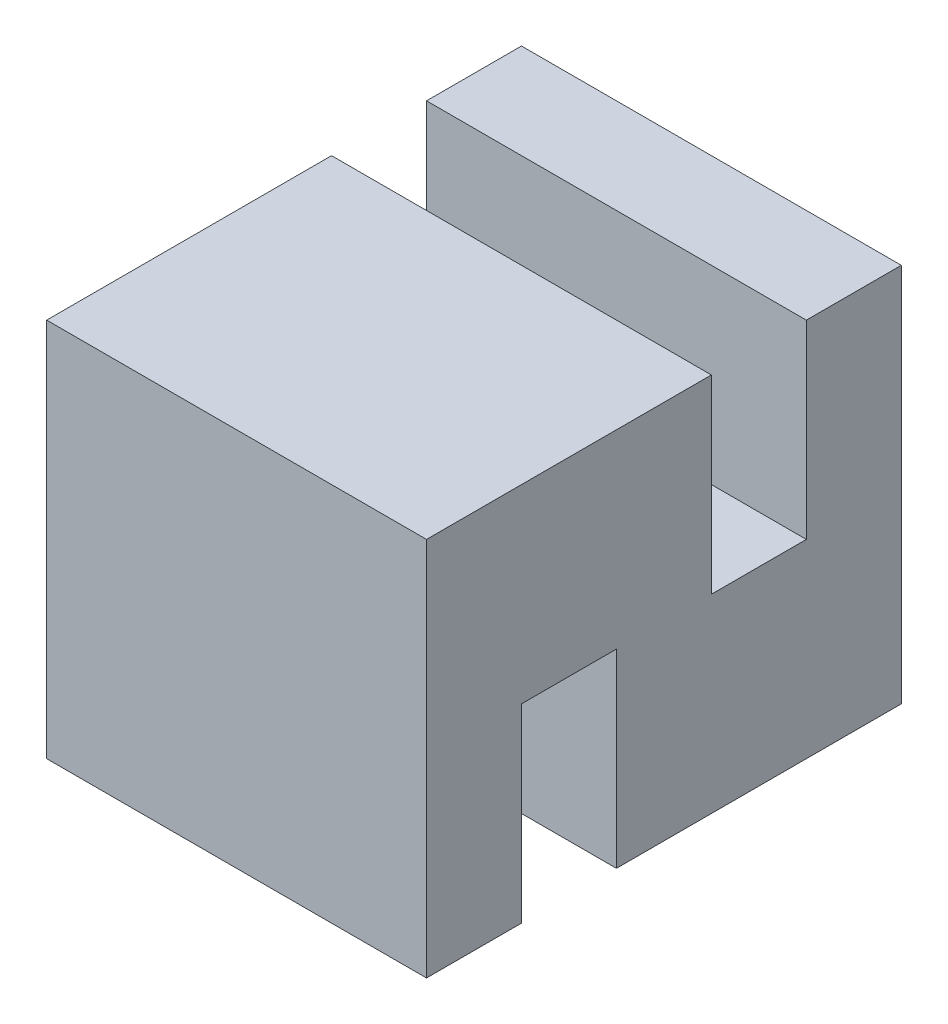
ISO-10303-21;
HEADER;
FILE_DESCRIPTION(('STEP AP214'),'2;1');
FILE_NAME('part.step','',(''),(''),'','','');
FILE_SCHEMA(('AUTOMOTIVE_DESIGN { 1 0 10303 214 1 1 1 1 }'));
ENDSEC;
DATA;
#1=APPLICATION_CONTEXT('core data for automotive mechanical design processes');
#2=APPLICATION_PROTOCOL_DEFINITION('international standard','automotive_design',2000,#1);
#3=PRODUCT_CONTEXT('',#1,'mechanical');
#4=PRODUCT('Part','Part','',(#3));
#5=PRODUCT_RELATED_PRODUCT_CATEGORY('part','',(#4));
#6=PRODUCT_DEFINITION_FORMATION('','',#4);
#7=PRODUCT_DEFINITION_CONTEXT('part definition',#1,'design');
#8=PRODUCT_DEFINITION('design','',#6,#7);
#9=PRODUCT_DEFINITION_SHAPE('','',#8);
#10=(LENGTH_UNIT() NAMED_UNIT(*) SI_UNIT(.MILLI.,.METRE.));
#11=(NAMED_UNIT(*) PLANE_ANGLE_UNIT() SI_UNIT($,.RADIAN.));
#12=(NAMED_UNIT(*) SI_UNIT($,.STERADIAN.) SOLID_ANGLE_UNIT());
#13=UNCERTAINTY_MEASURE_WITH_UNIT(LENGTH_MEASURE(1.E-05),#10,'distance_accuracy_value','');
#14=(GEOMETRIC_REPRESENTATION_CONTEXT(3) GLOBAL_UNCERTAINTY_ASSIGNED_CONTEXT((#13)) GLOBAL_UNIT_ASSIGNED_CONTEXT((#10,
#11,#12)) REPRESENTATION_CONTEXT('',''));
#15=CARTESIAN_POINT('',(0.,0.,0.));
#16=DIRECTION('',(0.,0.,1.));
#17=DIRECTION('',(1.,0.,0.));
#18=AXIS2_PLACEMENT_3D('',#15,#16,#17);
#19=CARTESIAN_POINT('',(0.,0.,0.));
#20=DIRECTION('',(0.,0.,1.));
#21=DIRECTION('',(1.,0.,0.));
#22=AXIS2_PLACEMENT_3D('',#19,#20,#21);
#23=PLANE('',#22);
#24=DIRECTION('',(-1.,0.,0.));
#25=VECTOR('',#24,1.);
#26=CARTESIAN_POINT('',(3.,-1.5,0.));
#27=LINE('',#26,#25);
#28=CARTESIAN_POINT('',(3.,-1.5,0.));
#29=VERTEX_POINT('',#28);
#30=CARTESIAN_POINT('',(-3.,-1.5,0.));
#31=VERTEX_POINT('',#30);
#32=EDGE_CURVE('E56',#29,#31,#27,.T.);
#33=ORIENTED_EDGE('',*,*,#32,.F.);
#34=DIRECTION('',(0.,1.,0.));
#35=VECTOR('',#34,1.);
#36=CARTESIAN_POINT('',(3.,1.5,0.));
#37=LINE('',#36,#35);
#38=CARTESIAN_POINT('',(3.,-4.5,0.));
#39=VERTEX_POINT('',#38);
#40=EDGE_CURVE('E197',#39,#29,#37,.T.);
#41=ORIENTED_EDGE('',*,*,#40,.F.);
#42=DIRECTION('',(1.,0.,0.));
#43=VECTOR('',#42,1.);
#44=CARTESIAN_POINT('',(-3.,-4.5,0.));
#45=LINE('',#44,#43);
#46=CARTESIAN_POINT('',(-3.,-4.5,0.));
#47=VERTEX_POINT('',#46);
#48=EDGE_CURVE('E205',#47,#39,#45,.T.);
#49=ORIENTED_EDGE('',*,*,#48,.F.);
#50=DIRECTION('',(0.,-1.,0.));
#51=VECTOR('',#50,1.);
#52=CARTESIAN_POINT('',(-3.,1.5,0.));
#53=LINE('',#52,#51);
#54=EDGE_CURVE('E188',#31,#47,#53,.T.);
#55=ORIENTED_EDGE('',*,*,#54,.F.);
#56=EDGE_LOOP('',(#33,#41,#49,#55));
#57=FACE_BOUND('',#56,.T.);
#58=ADVANCED_FACE('F33',(#57),#23,.F.);
#59=CARTESIAN_POINT('',(-3.,1.5,1.5));
#60=DIRECTION('',(1.,0.,0.));
#61=DIRECTION('',(0.,1.,0.));
#62=AXIS2_PLACEMENT_3D('',#59,#60,#61);
#63=PLANE('',#62);
#64=DIRECTION('',(0.,0.,-1.));
#65=VECTOR('',#64,1.);
#66=CARTESIAN_POINT('',(-3.,1.5,1.5));
#67=LINE('',#66,#65);
#68=CARTESIAN_POINT('',(-3.,1.5,1.5));
#69=VERTEX_POINT('',#68);
#70=CARTESIAN_POINT('',(-3.,1.5,-3.));
#71=VERTEX_POINT('',#70);
#72=EDGE_CURVE('E203',#69,#71,#67,.T.);
#73=ORIENTED_EDGE('',*,*,#72,.T.);
#74=DIRECTION('',(0.,1.,0.));
#75=VECTOR('',#74,1.);
#76=CARTESIAN_POINT('',(-3.,-4.5,-3.));
#77=LINE('',#76,#75);
#78=CARTESIAN_POINT('',(-3.,-1.5,-3.));
#79=VERTEX_POINT('',#78);
#80=EDGE_CURVE('E164',#79,#71,#77,.T.);
#81=ORIENTED_EDGE('',*,*,#80,.F.);
#82=DIRECTION('',(0.,0.,1.));
#83=VECTOR('',#82,1.);
#84=CARTESIAN_POINT('',(-3.,-1.5,-4.5));
#85=LINE('',#84,#83);
#86=CARTESIAN_POINT('',(-3.,-1.5,-4.5));
#87=VERTEX_POINT('',#86);
#88=EDGE_CURVE('E160',#87,#79,#85,.T.);
#89=ORIENTED_EDGE('',*,*,#88,.F.);
#90=DIRECTION('',(0.,1.,0.));
#91=VECTOR('',#90,1.);
#92=CARTESIAN_POINT('',(-3.,-4.5,-4.5));
#93=LINE('',#92,#91);
#94=CARTESIAN_POINT('',(-3.,1.5,-4.5));
#95=VERTEX_POINT('',#94);
#96=EDGE_CURVE('E147',#87,#95,#93,.T.);
#97=ORIENTED_EDGE('',*,*,#96,.T.);
#98=DIRECTION('',(0.,0.,1.));
#99=VECTOR('',#98,1.);
#100=CARTESIAN_POINT('',(-3.,1.5,-6.));
#101=LINE('',#100,#99);
#102=CARTESIAN_POINT('',(-3.,1.5,-6.));
#103=VERTEX_POINT('',#102);
#104=EDGE_CURVE('E127',#103,#95,#101,.T.);
#105=ORIENTED_EDGE('',*,*,#104,.F.);
#106=DIRECTION('',(0.,1.,0.));
#107=VECTOR('',#106,1.);
#108=CARTESIAN_POINT('',(-3.,-4.5,-6.));
#109=LINE('',#108,#107);
#110=CARTESIAN_POINT('',(-3.,-4.5,-6.));
#111=VERTEX_POINT('',#110);
#112=EDGE_CURVE('E134',#111,#103,#109,.T.);
#113=ORIENTED_EDGE('',*,*,#112,.F.);
#114=DIRECTION('',(0.,0.,1.));
#115=VECTOR('',#114,1.);
#116=CARTESIAN_POINT('',(-3.,-4.5,-3.));
#117=LINE('',#116,#115);
#118=CARTESIAN_POINT('',(-3.,-4.5,-1.5));
#119=VERTEX_POINT('',#118);
#120=EDGE_CURVE('E172',#111,#119,#117,.T.);
#121=ORIENTED_EDGE('',*,*,#120,.T.);
#122=DIRECTION('',(0.,1.,0.));
#123=VECTOR('',#122,1.);
#124=CARTESIAN_POINT('',(-3.,-4.5,-1.5));
#125=LINE('',#124,#123);
#126=CARTESIAN_POINT('',(-3.,-1.5,-1.5));
#127=VERTEX_POINT('',#126);
#128=EDGE_CURVE('E163',#119,#127,#125,.T.);
#129=ORIENTED_EDGE('',*,*,#128,.T.);
#130=DIRECTION('',(0.,0.,1.));
#131=VECTOR('',#130,1.);
#132=CARTESIAN_POINT('',(-3.,-1.5,-8.20820393249937));
#133=LINE('',#132,#131);
#134=EDGE_CURVE('E184',#127,#31,#133,.T.);
#135=ORIENTED_EDGE('',*,*,#134,.T.);
#136=ORIENTED_EDGE('',*,*,#54,.T.);
#137=DIRECTION('',(0.,0.,-1.));
#138=VECTOR('',#137,1.);
#139=CARTESIAN_POINT('',(-3.,-4.5,1.5));
#140=LINE('',#139,#138);
#141=CARTESIAN_POINT('',(-3.,-4.5,1.5));
#142=VERTEX_POINT('',#141);
#143=EDGE_CURVE('E11',#142,#47,#140,.T.);
#144=ORIENTED_EDGE('',*,*,#143,.F.);
#145=DIRECTION('',(0.,-1.,0.));
#146=VECTOR('',#145,1.);
#147=CARTESIAN_POINT('',(-3.,1.5,1.5));
#148=LINE('',#147,#146);
#149=EDGE_CURVE('E193',#69,#142,#148,.T.);
#150=ORIENTED_EDGE('',*,*,#149,.F.);
#151=EDGE_LOOP('',(#73,#81,#89,#97,#105,#113,#121,#129,#135,#136,#144,#150));
#152=FACE_BOUND('',#151,.T.);
#153=ADVANCED_FACE('F35',(#152),#63,.F.);
#154=CARTESIAN_POINT('',(-3.,-4.5,1.5));
#155=DIRECTION('',(0.,1.,0.));
#156=DIRECTION('',(0.,0.,1.));
#157=AXIS2_PLACEMENT_3D('',#154,#155,#156);
#158=PLANE('',#157);
#159=ORIENTED_EDGE('',*,*,#48,.T.);
#160=DIRECTION('',(0.,0.,-1.));
#161=VECTOR('',#160,1.);
#162=CARTESIAN_POINT('',(3.,-4.5,1.5));
#163=LINE('',#162,#161);
#164=CARTESIAN_POINT('',(3.,-4.5,1.5));
#165=VERTEX_POINT('',#164);
#166=EDGE_CURVE('E41',#165,#39,#163,.T.);
#167=ORIENTED_EDGE('',*,*,#166,.F.);
#168=DIRECTION('',(1.,0.,0.));
#169=VECTOR('',#168,1.);
#170=CARTESIAN_POINT('',(-3.,-4.5,1.5));
#171=LINE('',#170,#169);
#172=EDGE_CURVE('E196',#142,#165,#171,.T.);
#173=ORIENTED_EDGE('',*,*,#172,.F.);
#174=ORIENTED_EDGE('',*,*,#143,.T.);
#175=EDGE_LOOP('',(#159,#167,#173,#174));
#176=FACE_BOUND('',#175,.T.);
#177=ADVANCED_FACE('F220',(#176),#158,.F.);
#178=CARTESIAN_POINT('',(3.,1.5,1.5));
#179=DIRECTION('',(-1.,0.,0.));
#180=DIRECTION('',(0.,-1.,0.));
#181=AXIS2_PLACEMENT_3D('',#178,#179,#180);
#182=PLANE('',#181);
#183=ORIENTED_EDGE('',*,*,#40,.T.);
#184=DIRECTION('',(0.,0.,1.));
#185=VECTOR('',#184,1.);
#186=CARTESIAN_POINT('',(3.,-1.5,-8.20820393249937));
#187=LINE('',#186,#185);
#188=CARTESIAN_POINT('',(3.,-1.5,-1.5));
#189=VERTEX_POINT('',#188);
#190=EDGE_CURVE('E182',#189,#29,#187,.T.);
#191=ORIENTED_EDGE('',*,*,#190,.F.);
#192=DIRECTION('',(0.,-1.,0.));
#193=VECTOR('',#192,1.);
#194=CARTESIAN_POINT('',(3.,1.5,-1.5));
#195=LINE('',#194,#193);
#196=CARTESIAN_POINT('',(3.,-4.5,-1.5));
#197=VERTEX_POINT('',#196);
#198=EDGE_CURVE('E175',#189,#197,#195,.T.);
#199=ORIENTED_EDGE('',*,*,#198,.T.);
#200=DIRECTION('',(0.,0.,1.));
#201=VECTOR('',#200,1.);
#202=CARTESIAN_POINT('',(3.,-4.5,-3.));
#203=LINE('',#202,#201);
#204=CARTESIAN_POINT('',(3.,-4.5,-6.));
#205=VERTEX_POINT('',#204);
#206=EDGE_CURVE('E179',#205,#197,#203,.T.);
#207=ORIENTED_EDGE('',*,*,#206,.F.);
#208=DIRECTION('',(0.,-1.,0.));
#209=VECTOR('',#208,1.);
#210=CARTESIAN_POINT('',(3.,1.5,-6.));
#211=LINE('',#210,#209);
#212=CARTESIAN_POINT('',(3.,1.5,-6.));
#213=VERTEX_POINT('',#212);
#214=EDGE_CURVE('E133',#213,#205,#211,.T.);
#215=ORIENTED_EDGE('',*,*,#214,.F.);
#216=DIRECTION('',(0.,0.,1.));
#217=VECTOR('',#216,1.);
#218=CARTESIAN_POINT('',(3.,1.5,-6.));
#219=LINE('',#218,#217);
#220=CARTESIAN_POINT('',(3.,1.5,-4.5));
#221=VERTEX_POINT('',#220);
#222=EDGE_CURVE('E129',#213,#221,#219,.T.);
#223=ORIENTED_EDGE('',*,*,#222,.T.);
#224=DIRECTION('',(0.,-1.,0.));
#225=VECTOR('',#224,1.);
#226=CARTESIAN_POINT('',(3.,1.5,-4.5));
#227=LINE('',#226,#225);
#228=CARTESIAN_POINT('',(3.,-1.5,-4.5));
#229=VERTEX_POINT('',#228);
#230=EDGE_CURVE('E143',#221,#229,#227,.T.);
#231=ORIENTED_EDGE('',*,*,#230,.T.);
#232=DIRECTION('',(0.,0.,1.));
#233=VECTOR('',#232,1.);
#234=CARTESIAN_POINT('',(3.,-1.5,-4.5));
#235=LINE('',#234,#233);
#236=CARTESIAN_POINT('',(3.,-1.5,-3.));
#237=VERTEX_POINT('',#236);
#238=EDGE_CURVE('E156',#229,#237,#235,.T.);
#239=ORIENTED_EDGE('',*,*,#238,.T.);
#240=DIRECTION('',(0.,-1.,0.));
#241=VECTOR('',#240,1.);
#242=CARTESIAN_POINT('',(3.,1.5,-3.));
#243=LINE('',#242,#241);
#244=CARTESIAN_POINT('',(3.,1.5,-3.));
#245=VERTEX_POINT('',#244);
#246=EDGE_CURVE('E170',#245,#237,#243,.T.);
#247=ORIENTED_EDGE('',*,*,#246,.F.);
#248=DIRECTION('',(0.,0.,-1.));
#249=VECTOR('',#248,1.);
#250=CARTESIAN_POINT('',(3.,1.5,1.5));
#251=LINE('',#250,#249);
#252=CARTESIAN_POINT('',(3.,1.5,1.5));
#253=VERTEX_POINT('',#252);
#254=EDGE_CURVE('E209',#253,#245,#251,.T.);
#255=ORIENTED_EDGE('',*,*,#254,.F.);
#256=DIRECTION('',(0.,1.,0.));
#257=VECTOR('',#256,1.);
#258=CARTESIAN_POINT('',(3.,1.5,1.5));
#259=LINE('',#258,#257);
#260=EDGE_CURVE('E199',#165,#253,#259,.T.);
#261=ORIENTED_EDGE('',*,*,#260,.F.);
#262=ORIENTED_EDGE('',*,*,#166,.T.);
#263=EDGE_LOOP('',(#183,#191,#199,#207,#215,#223,#231,#239,#247,#255,#261,#262));
#264=FACE_BOUND('',#263,.T.);
#265=ADVANCED_FACE('F214',(#264),#182,.F.);
#266=CARTESIAN_POINT('',(-3.,1.5,1.5));
#267=DIRECTION('',(0.,-1.,0.));
#268=DIRECTION('',(1.,0.,0.));
#269=AXIS2_PLACEMENT_3D('',#266,#267,#268);
#270=PLANE('',#269);
#271=ORIENTED_EDGE('',*,*,#254,.T.);
#272=DIRECTION('',(1.,0.,0.));
#273=VECTOR('',#272,1.);
#274=CARTESIAN_POINT('',(-3.,1.5,-3.));
#275=LINE('',#274,#273);
#276=EDGE_CURVE('E166',#71,#245,#275,.T.);
#277=ORIENTED_EDGE('',*,*,#276,.F.);
#278=ORIENTED_EDGE('',*,*,#72,.F.);
#279=DIRECTION('',(-1.,0.,0.));
#280=VECTOR('',#279,1.);
#281=CARTESIAN_POINT('',(-3.,1.5,1.5));
#282=LINE('',#281,#280);
#283=EDGE_CURVE('E201',#253,#69,#282,.T.);
#284=ORIENTED_EDGE('',*,*,#283,.F.);
#285=EDGE_LOOP('',(#271,#277,#278,#284));
#286=FACE_BOUND('',#285,.T.);
#287=ADVANCED_FACE('F249',(#286),#270,.F.);
#288=CARTESIAN_POINT('',(0.,0.,1.5));
#289=DIRECTION('',(0.,0.,1.));
#290=DIRECTION('',(1.,0.,0.));
#291=AXIS2_PLACEMENT_3D('',#288,#289,#290);
#292=PLANE('',#291);
#293=ORIENTED_EDGE('',*,*,#149,.T.);
#294=ORIENTED_EDGE('',*,*,#172,.T.);
#295=ORIENTED_EDGE('',*,*,#260,.T.);
#296=ORIENTED_EDGE('',*,*,#283,.T.);
#297=EDGE_LOOP('',(#293,#294,#295,#296));
#298=FACE_BOUND('',#297,.T.);
#299=ADVANCED_FACE('F251',(#298),#292,.T.);
#300=CARTESIAN_POINT('',(3.,-1.5,-8.20820393249937));
#301=DIRECTION('',(0.,1.,0.));
#302=DIRECTION('',(-1.,0.,0.));
#303=AXIS2_PLACEMENT_3D('',#300,#301,#302);
#304=PLANE('',#303);
#305=DIRECTION('',(-1.,0.,0.));
#306=VECTOR('',#305,1.);
#307=CARTESIAN_POINT('',(3.,-1.5,-1.5));
#308=LINE('',#307,#306);
#309=EDGE_CURVE('E185',#189,#127,#308,.T.);
#310=ORIENTED_EDGE('',*,*,#309,.F.);
#311=ORIENTED_EDGE('',*,*,#190,.T.);
#312=ORIENTED_EDGE('',*,*,#32,.T.);
#313=ORIENTED_EDGE('',*,*,#134,.F.);
#314=EDGE_LOOP('',(#310,#311,#312,#313));
#315=FACE_BOUND('',#314,.T.);
#316=ADVANCED_FACE('F224',(#315),#304,.F.);
#317=CARTESIAN_POINT('',(0.,0.,-1.5));
#318=DIRECTION('',(0.,0.,-1.));
#319=DIRECTION('',(-1.,0.,0.));
#320=AXIS2_PLACEMENT_3D('',#317,#318,#319);
#321=PLANE('',#320);
#322=ORIENTED_EDGE('',*,*,#198,.F.);
#323=ORIENTED_EDGE('',*,*,#309,.T.);
#324=ORIENTED_EDGE('',*,*,#128,.F.);
#325=DIRECTION('',(-1.,0.,0.));
#326=VECTOR('',#325,1.);
#327=CARTESIAN_POINT('',(3.,-4.5,-1.5));
#328=LINE('',#327,#326);
#329=EDGE_CURVE('E167',#197,#119,#328,.T.);
#330=ORIENTED_EDGE('',*,*,#329,.F.);
#331=EDGE_LOOP('',(#322,#323,#324,#330));
#332=FACE_BOUND('',#331,.T.);
#333=ADVANCED_FACE('F228',(#332),#321,.F.);
#334=CARTESIAN_POINT('',(3.,-4.5,-3.));
#335=DIRECTION('',(0.,1.,0.));
#336=DIRECTION('',(0.,0.,1.));
#337=AXIS2_PLACEMENT_3D('',#334,#335,#336);
#338=PLANE('',#337);
#339=ORIENTED_EDGE('',*,*,#329,.T.);
#340=ORIENTED_EDGE('',*,*,#120,.F.);
#341=DIRECTION('',(-1.,0.,0.));
#342=VECTOR('',#341,1.);
#343=CARTESIAN_POINT('',(3.,-4.5,-6.));
#344=LINE('',#343,#342);
#345=EDGE_CURVE('E140',#205,#111,#344,.T.);
#346=ORIENTED_EDGE('',*,*,#345,.F.);
#347=ORIENTED_EDGE('',*,*,#206,.T.);
#348=EDGE_LOOP('',(#339,#340,#346,#347));
#349=FACE_BOUND('',#348,.T.);
#350=ADVANCED_FACE('F230',(#349),#338,.F.);
#351=CARTESIAN_POINT('',(0.,0.,-3.));
#352=DIRECTION('',(0.,0.,-1.));
#353=DIRECTION('',(-1.,0.,0.));
#354=AXIS2_PLACEMENT_3D('',#351,#352,#353);
#355=PLANE('',#354);
#356=DIRECTION('',(1.,0.,0.));
#357=VECTOR('',#356,1.);
#358=CARTESIAN_POINT('',(3.,-1.5,-3.));
#359=LINE('',#358,#357);
#360=EDGE_CURVE('E48',#79,#237,#359,.T.);
#361=ORIENTED_EDGE('',*,*,#360,.F.);
#362=ORIENTED_EDGE('',*,*,#80,.T.);
#363=ORIENTED_EDGE('',*,*,#276,.T.);
#364=ORIENTED_EDGE('',*,*,#246,.T.);
#365=EDGE_LOOP('',(#361,#362,#363,#364));
#366=FACE_BOUND('',#365,.T.);
#367=ADVANCED_FACE('F246',(#366),#355,.T.);
#368=CARTESIAN_POINT('',(3.,-1.5,-4.5));
#369=DIRECTION('',(0.,-1.,0.));
#370=DIRECTION('',(1.,0.,0.));
#371=AXIS2_PLACEMENT_3D('',#368,#369,#370);
#372=PLANE('',#371);
#373=ORIENTED_EDGE('',*,*,#360,.T.);
#374=ORIENTED_EDGE('',*,*,#238,.F.);
#375=DIRECTION('',(1.,0.,0.));
#376=VECTOR('',#375,1.);
#377=CARTESIAN_POINT('',(3.,-1.5,-4.5));
#378=LINE('',#377,#376);
#379=EDGE_CURVE('E150',#87,#229,#378,.T.);
#380=ORIENTED_EDGE('',*,*,#379,.F.);
#381=ORIENTED_EDGE('',*,*,#88,.T.);
#382=EDGE_LOOP('',(#373,#374,#380,#381));
#383=FACE_BOUND('',#382,.T.);
#384=ADVANCED_FACE('F243',(#383),#372,.F.);
#385=CARTESIAN_POINT('',(0.,0.,-4.5));
#386=DIRECTION('',(0.,0.,-1.));
#387=DIRECTION('',(-1.,0.,0.));
#388=AXIS2_PLACEMENT_3D('',#385,#386,#387);
#389=PLANE('',#388);
#390=ORIENTED_EDGE('',*,*,#96,.F.);
#391=ORIENTED_EDGE('',*,*,#379,.T.);
#392=ORIENTED_EDGE('',*,*,#230,.F.);
#393=DIRECTION('',(1.,0.,0.));
#394=VECTOR('',#393,1.);
#395=CARTESIAN_POINT('',(-3.,1.5,-4.5));
#396=LINE('',#395,#394);
#397=EDGE_CURVE('E235',#95,#221,#396,.T.);
#398=ORIENTED_EDGE('',*,*,#397,.F.);
#399=EDGE_LOOP('',(#390,#391,#392,#398));
#400=FACE_BOUND('',#399,.T.);
#401=ADVANCED_FACE('F240',(#400),#389,.F.);
#402=CARTESIAN_POINT('',(-3.,1.5,-6.));
#403=DIRECTION('',(0.,-1.,0.));
#404=DIRECTION('',(1.,0.,0.));
#405=AXIS2_PLACEMENT_3D('',#402,#403,#404);
#406=PLANE('',#405);
#407=ORIENTED_EDGE('',*,*,#397,.T.);
#408=ORIENTED_EDGE('',*,*,#222,.F.);
#409=DIRECTION('',(1.,0.,0.));
#410=VECTOR('',#409,1.);
#411=CARTESIAN_POINT('',(-3.,1.5,-6.));
#412=LINE('',#411,#410);
#413=EDGE_CURVE('E123',#103,#213,#412,.T.);
#414=ORIENTED_EDGE('',*,*,#413,.F.);
#415=ORIENTED_EDGE('',*,*,#104,.T.);
#416=EDGE_LOOP('',(#407,#408,#414,#415));
#417=FACE_BOUND('',#416,.T.);
#418=ADVANCED_FACE('F125',(#417),#406,.F.);
#419=CARTESIAN_POINT('',(0.,0.,-6.));
#420=DIRECTION('',(0.,0.,-1.));
#421=DIRECTION('',(-1.,0.,0.));
#422=AXIS2_PLACEMENT_3D('',#419,#420,#421);
#423=PLANE('',#422);
#424=ORIENTED_EDGE('',*,*,#112,.T.);
#425=ORIENTED_EDGE('',*,*,#413,.T.);
#426=ORIENTED_EDGE('',*,*,#214,.T.);
#427=ORIENTED_EDGE('',*,*,#345,.T.);
#428=EDGE_LOOP('',(#424,#425,#426,#427));
#429=FACE_BOUND('',#428,.T.);
#430=ADVANCED_FACE('F138',(#429),#423,.T.);
#431=CLOSED_SHELL('',(#58,#153,#177,#265,#287,#299,#316,#333,#350,#367,#384,#401,#418,#430));
#432=MANIFOLD_SOLID_BREP('B2',#431);
#433=ADVANCED_BREP_SHAPE_REPRESENTATION('',(#18,#432),#14);
#434=SHAPE_DEFINITION_REPRESENTATION(#9,#433);
ENDSEC;
END-ISO-10303-21;
